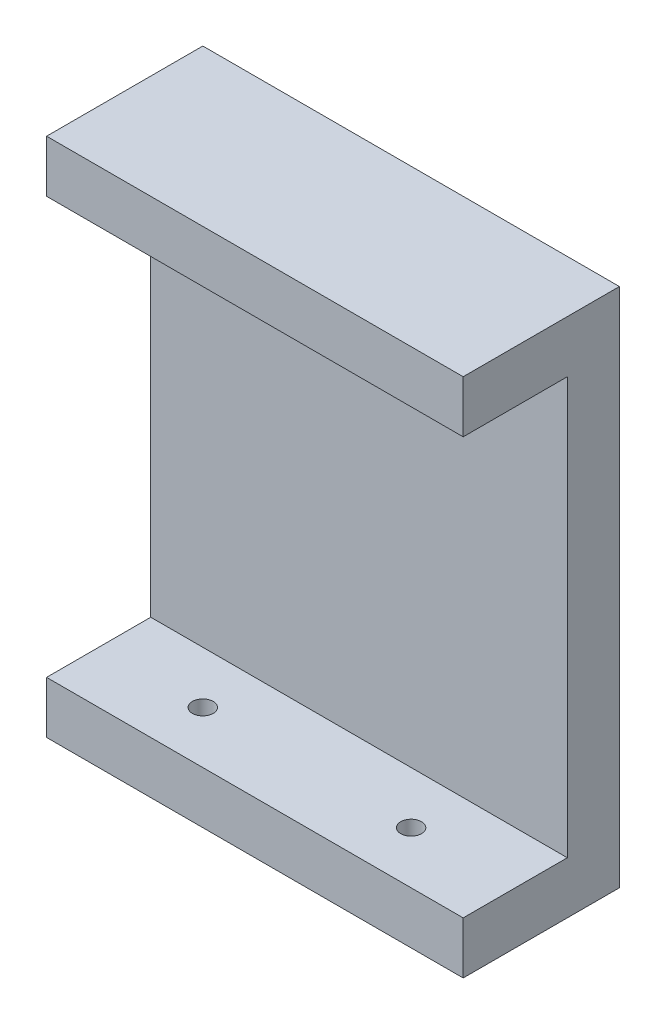
ISO-10303-21;
HEADER;
FILE_DESCRIPTION(('STEP AP214'),'2;1');
FILE_NAME('part.step','',(''),(''),'','','');
FILE_SCHEMA(('AUTOMOTIVE_DESIGN { 1 0 10303 214 1 1 1 1 }'));
ENDSEC;
DATA;
#1=APPLICATION_CONTEXT('core data for automotive mechanical design processes');
#2=APPLICATION_PROTOCOL_DEFINITION('international standard','automotive_design',2000,#1);
#3=PRODUCT_CONTEXT('',#1,'mechanical');
#4=PRODUCT('Part','Part','',(#3));
#5=PRODUCT_RELATED_PRODUCT_CATEGORY('part','',(#4));
#6=PRODUCT_DEFINITION_FORMATION('','',#4);
#7=PRODUCT_DEFINITION_CONTEXT('part definition',#1,'design');
#8=PRODUCT_DEFINITION('design','',#6,#7);
#9=PRODUCT_DEFINITION_SHAPE('','',#8);
#10=(LENGTH_UNIT() NAMED_UNIT(*) SI_UNIT(.MILLI.,.METRE.));
#11=(NAMED_UNIT(*) PLANE_ANGLE_UNIT() SI_UNIT($,.RADIAN.));
#12=(NAMED_UNIT(*) SI_UNIT($,.STERADIAN.) SOLID_ANGLE_UNIT());
#13=UNCERTAINTY_MEASURE_WITH_UNIT(LENGTH_MEASURE(1.E-05),#10,'distance_accuracy_value','');
#14=(GEOMETRIC_REPRESENTATION_CONTEXT(3) GLOBAL_UNCERTAINTY_ASSIGNED_CONTEXT((#13)) GLOBAL_UNIT_ASSIGNED_CONTEXT((#10,
#11,#12)) REPRESENTATION_CONTEXT('',''));
#15=CARTESIAN_POINT('',(0.,0.,0.));
#16=DIRECTION('',(0.,0.,1.));
#17=DIRECTION('',(1.,0.,0.));
#18=AXIS2_PLACEMENT_3D('',#15,#16,#17);
#19=CARTESIAN_POINT('',(0.,0.,10.));
#20=DIRECTION('',(0.,0.,1.));
#21=DIRECTION('',(1.,0.,0.));
#22=AXIS2_PLACEMENT_3D('',#19,#20,#21);
#23=PLANE('',#22);
#24=DIRECTION('',(0.,1.,0.));
#25=VECTOR('',#24,1.);
#26=CARTESIAN_POINT('',(40.,50.,10.));
#27=LINE('',#26,#25);
#28=CARTESIAN_POINT('',(40.,-40.,10.));
#29=VERTEX_POINT('',#28);
#30=CARTESIAN_POINT('',(40.,40.,10.));
#31=VERTEX_POINT('',#30);
#32=EDGE_CURVE('E64',#29,#31,#27,.T.);
#33=ORIENTED_EDGE('',*,*,#32,.T.);
#34=DIRECTION('',(1.,0.,0.));
#35=VECTOR('',#34,1.);
#36=CARTESIAN_POINT('',(-40.,40.,10.));
#37=LINE('',#36,#35);
#38=CARTESIAN_POINT('',(-40.,40.,10.));
#39=VERTEX_POINT('',#38);
#40=EDGE_CURVE('E59',#39,#31,#37,.T.);
#41=ORIENTED_EDGE('',*,*,#40,.F.);
#42=DIRECTION('',(0.,-1.,0.));
#43=VECTOR('',#42,1.);
#44=CARTESIAN_POINT('',(-40.,50.,10.));
#45=LINE('',#44,#43);
#46=CARTESIAN_POINT('',(-40.,-40.,10.));
#47=VERTEX_POINT('',#46);
#48=EDGE_CURVE('E168',#39,#47,#45,.T.);
#49=ORIENTED_EDGE('',*,*,#48,.T.);
#50=DIRECTION('',(-1.,0.,0.));
#51=VECTOR('',#50,1.);
#52=CARTESIAN_POINT('',(-40.,-40.,10.));
#53=LINE('',#52,#51);
#54=EDGE_CURVE('E131',#29,#47,#53,.T.);
#55=ORIENTED_EDGE('',*,*,#54,.F.);
#56=EDGE_LOOP('',(#33,#41,#49,#55));
#57=FACE_BOUND('',#56,.T.);
#58=ADVANCED_FACE('F42',(#57),#23,.T.);
#59=CARTESIAN_POINT('',(40.,50.,10.));
#60=DIRECTION('',(-1.,0.,0.));
#61=DIRECTION('',(0.,-1.,0.));
#62=AXIS2_PLACEMENT_3D('',#59,#60,#61);
#63=PLANE('',#62);
#64=DIRECTION('',(0.,1.,0.));
#65=VECTOR('',#64,1.);
#66=CARTESIAN_POINT('',(40.,50.,0.));
#67=LINE('',#66,#65);
#68=CARTESIAN_POINT('',(40.,-50.,0.));
#69=VERTEX_POINT('',#68);
#70=CARTESIAN_POINT('',(40.,50.,0.));
#71=VERTEX_POINT('',#70);
#72=EDGE_CURVE('E158',#69,#71,#67,.T.);
#73=ORIENTED_EDGE('',*,*,#72,.T.);
#74=DIRECTION('',(0.,0.,-1.));
#75=VECTOR('',#74,1.);
#76=CARTESIAN_POINT('',(40.,50.,10.));
#77=LINE('',#76,#75);
#78=CARTESIAN_POINT('',(40.,50.,30.));
#79=VERTEX_POINT('',#78);
#80=EDGE_CURVE('E13',#79,#71,#77,.T.);
#81=ORIENTED_EDGE('',*,*,#80,.F.);
#82=DIRECTION('',(0.,1.,0.));
#83=VECTOR('',#82,1.);
#84=CARTESIAN_POINT('',(40.,50.,30.));
#85=LINE('',#84,#83);
#86=CARTESIAN_POINT('',(40.,40.,30.));
#87=VERTEX_POINT('',#86);
#88=EDGE_CURVE('E123',#87,#79,#85,.T.);
#89=ORIENTED_EDGE('',*,*,#88,.F.);
#90=DIRECTION('',(0.,0.,-1.));
#91=VECTOR('',#90,1.);
#92=CARTESIAN_POINT('',(40.,40.,30.));
#93=LINE('',#92,#91);
#94=EDGE_CURVE('E124',#87,#31,#93,.T.);
#95=ORIENTED_EDGE('',*,*,#94,.T.);
#96=ORIENTED_EDGE('',*,*,#32,.F.);
#97=DIRECTION('',(0.,0.,-1.));
#98=VECTOR('',#97,1.);
#99=CARTESIAN_POINT('',(40.,-40.,30.));
#100=LINE('',#99,#98);
#101=CARTESIAN_POINT('',(40.,-40.,30.));
#102=VERTEX_POINT('',#101);
#103=EDGE_CURVE('E151',#102,#29,#100,.T.);
#104=ORIENTED_EDGE('',*,*,#103,.F.);
#105=DIRECTION('',(0.,1.,0.));
#106=VECTOR('',#105,1.);
#107=CARTESIAN_POINT('',(40.,-50.,30.));
#108=LINE('',#107,#106);
#109=CARTESIAN_POINT('',(40.,-50.,30.));
#110=VERTEX_POINT('',#109);
#111=EDGE_CURVE('E142',#110,#102,#108,.T.);
#112=ORIENTED_EDGE('',*,*,#111,.F.);
#113=DIRECTION('',(0.,0.,-1.));
#114=VECTOR('',#113,1.);
#115=CARTESIAN_POINT('',(40.,-50.,10.));
#116=LINE('',#115,#114);
#117=EDGE_CURVE('E171',#110,#69,#116,.T.);
#118=ORIENTED_EDGE('',*,*,#117,.T.);
#119=EDGE_LOOP('',(#73,#81,#89,#95,#96,#104,#112,#118));
#120=FACE_BOUND('',#119,.T.);
#121=ADVANCED_FACE('F44',(#120),#63,.F.);
#122=CARTESIAN_POINT('',(-40.,50.,10.));
#123=DIRECTION('',(0.,-1.,0.));
#124=DIRECTION('',(0.,0.,-1.));
#125=AXIS2_PLACEMENT_3D('',#122,#123,#124);
#126=PLANE('',#125);
#127=DIRECTION('',(-1.,0.,0.));
#128=VECTOR('',#127,1.);
#129=CARTESIAN_POINT('',(-40.,50.,0.));
#130=LINE('',#129,#128);
#131=CARTESIAN_POINT('',(-40.,50.,0.));
#132=VERTEX_POINT('',#131);
#133=EDGE_CURVE('E110',#71,#132,#130,.T.);
#134=ORIENTED_EDGE('',*,*,#133,.T.);
#135=DIRECTION('',(0.,0.,-1.));
#136=VECTOR('',#135,1.);
#137=CARTESIAN_POINT('',(-40.,50.,10.));
#138=LINE('',#137,#136);
#139=CARTESIAN_POINT('',(-40.,50.,30.));
#140=VERTEX_POINT('',#139);
#141=EDGE_CURVE('E51',#140,#132,#138,.T.);
#142=ORIENTED_EDGE('',*,*,#141,.F.);
#143=DIRECTION('',(-1.,0.,0.));
#144=VECTOR('',#143,1.);
#145=CARTESIAN_POINT('',(-40.,50.,30.));
#146=LINE('',#145,#144);
#147=EDGE_CURVE('E109',#79,#140,#146,.T.);
#148=ORIENTED_EDGE('',*,*,#147,.F.);
#149=ORIENTED_EDGE('',*,*,#80,.T.);
#150=EDGE_LOOP('',(#134,#142,#148,#149));
#151=FACE_BOUND('',#150,.T.);
#152=ADVANCED_FACE('F108',(#151),#126,.F.);
#153=CARTESIAN_POINT('',(-40.,50.,10.));
#154=DIRECTION('',(1.,0.,0.));
#155=DIRECTION('',(0.,1.,0.));
#156=AXIS2_PLACEMENT_3D('',#153,#154,#155);
#157=PLANE('',#156);
#158=DIRECTION('',(0.,-1.,0.));
#159=VECTOR('',#158,1.);
#160=CARTESIAN_POINT('',(-40.,50.,0.));
#161=LINE('',#160,#159);
#162=CARTESIAN_POINT('',(-40.,-50.,0.));
#163=VERTEX_POINT('',#162);
#164=EDGE_CURVE('E175',#132,#163,#161,.T.);
#165=ORIENTED_EDGE('',*,*,#164,.T.);
#166=DIRECTION('',(0.,0.,-1.));
#167=VECTOR('',#166,1.);
#168=CARTESIAN_POINT('',(-40.,-50.,10.));
#169=LINE('',#168,#167);
#170=CARTESIAN_POINT('',(-40.,-50.,30.));
#171=VERTEX_POINT('',#170);
#172=EDGE_CURVE('E114',#171,#163,#169,.T.);
#173=ORIENTED_EDGE('',*,*,#172,.F.);
#174=DIRECTION('',(0.,-1.,0.));
#175=VECTOR('',#174,1.);
#176=CARTESIAN_POINT('',(-40.,-50.,30.));
#177=LINE('',#176,#175);
#178=CARTESIAN_POINT('',(-40.,-40.,30.));
#179=VERTEX_POINT('',#178);
#180=EDGE_CURVE('E136',#179,#171,#177,.T.);
#181=ORIENTED_EDGE('',*,*,#180,.F.);
#182=DIRECTION('',(0.,0.,-1.));
#183=VECTOR('',#182,1.);
#184=CARTESIAN_POINT('',(-40.,-40.,30.));
#185=LINE('',#184,#183);
#186=EDGE_CURVE('E146',#179,#47,#185,.T.);
#187=ORIENTED_EDGE('',*,*,#186,.T.);
#188=ORIENTED_EDGE('',*,*,#48,.F.);
#189=DIRECTION('',(0.,0.,-1.));
#190=VECTOR('',#189,1.);
#191=CARTESIAN_POINT('',(-40.,40.,30.));
#192=LINE('',#191,#190);
#193=CARTESIAN_POINT('',(-40.,40.,30.));
#194=VERTEX_POINT('',#193);
#195=EDGE_CURVE('E128',#194,#39,#192,.T.);
#196=ORIENTED_EDGE('',*,*,#195,.F.);
#197=DIRECTION('',(0.,-1.,0.));
#198=VECTOR('',#197,1.);
#199=CARTESIAN_POINT('',(-40.,50.,30.));
#200=LINE('',#199,#198);
#201=EDGE_CURVE('E120',#140,#194,#200,.T.);
#202=ORIENTED_EDGE('',*,*,#201,.F.);
#203=ORIENTED_EDGE('',*,*,#141,.T.);
#204=EDGE_LOOP('',(#165,#173,#181,#187,#188,#196,#202,#203));
#205=FACE_BOUND('',#204,.T.);
#206=ADVANCED_FACE('F126',(#205),#157,.F.);
#207=CARTESIAN_POINT('',(-40.,-50.,10.));
#208=DIRECTION('',(0.,1.,0.));
#209=DIRECTION('',(0.,0.,1.));
#210=AXIS2_PLACEMENT_3D('',#207,#208,#209);
#211=PLANE('',#210);
#212=DIRECTION('',(1.,0.,0.));
#213=VECTOR('',#212,1.);
#214=CARTESIAN_POINT('',(-40.,-50.,0.));
#215=LINE('',#214,#213);
#216=EDGE_CURVE('E169',#163,#69,#215,.T.);
#217=ORIENTED_EDGE('',*,*,#216,.T.);
#218=ORIENTED_EDGE('',*,*,#117,.F.);
#219=DIRECTION('',(1.,0.,0.));
#220=VECTOR('',#219,1.);
#221=CARTESIAN_POINT('',(-40.,-50.,30.));
#222=LINE('',#221,#220);
#223=EDGE_CURVE('E139',#171,#110,#222,.T.);
#224=ORIENTED_EDGE('',*,*,#223,.F.);
#225=ORIENTED_EDGE('',*,*,#172,.T.);
#226=EDGE_LOOP('',(#217,#218,#224,#225));
#227=FACE_BOUND('',#226,.T.);
#228=ADVANCED_FACE('F245',(#227),#211,.F.);
#229=CARTESIAN_POINT('',(0.,0.,0.));
#230=DIRECTION('',(0.,0.,1.));
#231=DIRECTION('',(1.,0.,0.));
#232=AXIS2_PLACEMENT_3D('',#229,#230,#231);
#233=PLANE('',#232);
#234=CARTESIAN_POINT('',(30.,-20.,0.));
#235=DIRECTION('',(0.,0.,-1.));
#236=DIRECTION('',(-1.,0.,0.));
#237=AXIS2_PLACEMENT_3D('',#234,#235,#236);
#238=CIRCLE('',#237,4.);
#239=CARTESIAN_POINT('',(26.,-20.,0.));
#240=VERTEX_POINT('',#239);
#241=EDGE_CURVE('E159',#240,#240,#238,.T.);
#242=ORIENTED_EDGE('',*,*,#241,.F.);
#243=EDGE_LOOP('',(#242));
#244=FACE_BOUND('',#243,.T.);
#245=CARTESIAN_POINT('',(-30.,-20.,0.));
#246=DIRECTION('',(0.,0.,-1.));
#247=DIRECTION('',(1.,0.,0.));
#248=AXIS2_PLACEMENT_3D('',#245,#246,#247);
#249=CIRCLE('',#248,3.99999999999999);
#250=CARTESIAN_POINT('',(-26.,-20.,0.));
#251=VERTEX_POINT('',#250);
#252=EDGE_CURVE('E162',#251,#251,#249,.T.);
#253=ORIENTED_EDGE('',*,*,#252,.F.);
#254=EDGE_LOOP('',(#253));
#255=FACE_BOUND('',#254,.T.);
#256=ORIENTED_EDGE('',*,*,#72,.F.);
#257=ORIENTED_EDGE('',*,*,#216,.F.);
#258=ORIENTED_EDGE('',*,*,#164,.F.);
#259=ORIENTED_EDGE('',*,*,#133,.F.);
#260=EDGE_LOOP('',(#256,#257,#258,#259));
#261=FACE_BOUND('',#260,.T.);
#262=ADVANCED_FACE('F241',(#244,#255,#261),#233,.F.);
#263=CARTESIAN_POINT('',(-30.,-20.,7.));
#264=DIRECTION('',(0.,0.,-1.));
#265=DIRECTION('',(-1.,0.,0.));
#266=AXIS2_PLACEMENT_3D('',#263,#264,#265);
#267=CYLINDRICAL_SURFACE('',#266,3.99999999999999);
#268=CARTESIAN_POINT('',(-30.,-20.,7.));
#269=DIRECTION('',(0.,0.,-1.));
#270=DIRECTION('',(1.,0.,0.));
#271=AXIS2_PLACEMENT_3D('',#268,#269,#270);
#272=CIRCLE('',#271,3.99999999999999);
#273=CARTESIAN_POINT('',(-26.,-20.,7.));
#274=VERTEX_POINT('',#273);
#275=EDGE_CURVE('E154',#274,#274,#272,.T.);
#276=ORIENTED_EDGE('',*,*,#275,.F.);
#277=EDGE_LOOP('',(#276));
#278=FACE_BOUND('',#277,.T.);
#279=ORIENTED_EDGE('',*,*,#252,.T.);
#280=EDGE_LOOP('',(#279));
#281=FACE_BOUND('',#280,.T.);
#282=ADVANCED_FACE('F244',(#278,#281),#267,.F.);
#283=CARTESIAN_POINT('',(-30.,-20.,7.));
#284=DIRECTION('',(0.,0.,1.));
#285=DIRECTION('',(1.,0.,0.));
#286=AXIS2_PLACEMENT_3D('',#283,#284,#285);
#287=PLANE('',#286);
#288=ORIENTED_EDGE('',*,*,#275,.T.);
#289=EDGE_LOOP('',(#288));
#290=FACE_BOUND('',#289,.T.);
#291=ADVANCED_FACE('F239',(#290),#287,.F.);
#292=CARTESIAN_POINT('',(30.,-20.,7.));
#293=DIRECTION('',(0.,0.,-1.));
#294=DIRECTION('',(-1.,0.,0.));
#295=AXIS2_PLACEMENT_3D('',#292,#293,#294);
#296=CYLINDRICAL_SURFACE('',#295,4.);
#297=CARTESIAN_POINT('',(30.,-20.,7.));
#298=DIRECTION('',(0.,0.,-1.));
#299=DIRECTION('',(-1.,0.,0.));
#300=AXIS2_PLACEMENT_3D('',#297,#298,#299);
#301=CIRCLE('',#300,4.);
#302=CARTESIAN_POINT('',(26.,-20.,7.));
#303=VERTEX_POINT('',#302);
#304=EDGE_CURVE('E155',#303,#303,#301,.T.);
#305=ORIENTED_EDGE('',*,*,#304,.F.);
#306=EDGE_LOOP('',(#305));
#307=FACE_BOUND('',#306,.T.);
#308=ORIENTED_EDGE('',*,*,#241,.T.);
#309=EDGE_LOOP('',(#308));
#310=FACE_BOUND('',#309,.T.);
#311=ADVANCED_FACE('F396',(#307,#310),#296,.F.);
#312=CARTESIAN_POINT('',(30.,-20.,7.));
#313=DIRECTION('',(0.,0.,-1.));
#314=DIRECTION('',(-1.,0.,0.));
#315=AXIS2_PLACEMENT_3D('',#312,#313,#314);
#316=PLANE('',#315);
#317=ORIENTED_EDGE('',*,*,#304,.T.);
#318=EDGE_LOOP('',(#317));
#319=FACE_BOUND('',#318,.T.);
#320=ADVANCED_FACE('F282',(#319),#316,.T.);
#321=CARTESIAN_POINT('',(-40.,-40.,30.));
#322=DIRECTION('',(0.,-1.,0.));
#323=DIRECTION('',(0.,0.,-1.));
#324=AXIS2_PLACEMENT_3D('',#321,#322,#323);
#325=PLANE('',#324);
#326=CARTESIAN_POINT('',(-20.,-40.,20.));
#327=DIRECTION('',(0.,-1.,0.));
#328=DIRECTION('',(0.,0.,-1.));
#329=AXIS2_PLACEMENT_3D('',#326,#327,#328);
#330=CIRCLE('',#329,2.);
#331=CARTESIAN_POINT('',(-20.,-40.,18.));
#332=VERTEX_POINT('',#331);
#333=EDGE_CURVE('E203',#332,#332,#330,.F.);
#334=ORIENTED_EDGE('',*,*,#333,.F.);
#335=EDGE_LOOP('',(#334));
#336=FACE_BOUND('',#335,.T.);
#337=CARTESIAN_POINT('',(20.,-40.,20.));
#338=DIRECTION('',(0.,-1.,0.));
#339=DIRECTION('',(0.,0.,-1.));
#340=AXIS2_PLACEMENT_3D('',#337,#338,#339);
#341=CIRCLE('',#340,2.);
#342=CARTESIAN_POINT('',(20.,-40.,18.));
#343=VERTEX_POINT('',#342);
#344=EDGE_CURVE('E183',#343,#343,#341,.F.);
#345=ORIENTED_EDGE('',*,*,#344,.F.);
#346=EDGE_LOOP('',(#345));
#347=FACE_BOUND('',#346,.T.);
#348=ORIENTED_EDGE('',*,*,#54,.T.);
#349=ORIENTED_EDGE('',*,*,#186,.F.);
#350=DIRECTION('',(-1.,0.,0.));
#351=VECTOR('',#350,1.);
#352=CARTESIAN_POINT('',(-40.,-40.,30.));
#353=LINE('',#352,#351);
#354=EDGE_CURVE('E144',#102,#179,#353,.T.);
#355=ORIENTED_EDGE('',*,*,#354,.F.);
#356=ORIENTED_EDGE('',*,*,#103,.T.);
#357=EDGE_LOOP('',(#348,#349,#355,#356));
#358=FACE_BOUND('',#357,.T.);
#359=ADVANCED_FACE('F225',(#336,#347,#358),#325,.F.);
#360=CARTESIAN_POINT('',(0.,0.,30.));
#361=DIRECTION('',(0.,0.,-1.));
#362=DIRECTION('',(-1.,0.,0.));
#363=AXIS2_PLACEMENT_3D('',#360,#361,#362);
#364=PLANE('',#363);
#365=ORIENTED_EDGE('',*,*,#180,.T.);
#366=ORIENTED_EDGE('',*,*,#223,.T.);
#367=ORIENTED_EDGE('',*,*,#111,.T.);
#368=ORIENTED_EDGE('',*,*,#354,.T.);
#369=EDGE_LOOP('',(#365,#366,#367,#368));
#370=FACE_BOUND('',#369,.T.);
#371=ADVANCED_FACE('F214',(#370),#364,.F.);
#372=CARTESIAN_POINT('',(-40.,40.,30.));
#373=DIRECTION('',(0.,1.,0.));
#374=DIRECTION('',(0.,0.,1.));
#375=AXIS2_PLACEMENT_3D('',#372,#373,#374);
#376=PLANE('',#375);
#377=CARTESIAN_POINT('',(-20.,40.,20.));
#378=DIRECTION('',(0.,1.,0.));
#379=DIRECTION('',(0.,0.,1.));
#380=AXIS2_PLACEMENT_3D('',#377,#378,#379);
#381=CIRCLE('',#380,2.);
#382=CARTESIAN_POINT('',(-20.,40.,22.));
#383=VERTEX_POINT('',#382);
#384=EDGE_CURVE('E46',#383,#383,#381,.F.);
#385=ORIENTED_EDGE('',*,*,#384,.F.);
#386=EDGE_LOOP('',(#385));
#387=FACE_BOUND('',#386,.T.);
#388=CARTESIAN_POINT('',(20.,40.,20.));
#389=DIRECTION('',(0.,1.,0.));
#390=DIRECTION('',(0.,0.,1.));
#391=AXIS2_PLACEMENT_3D('',#388,#389,#390);
#392=CIRCLE('',#391,2.);
#393=CARTESIAN_POINT('',(20.,40.,22.));
#394=VERTEX_POINT('',#393);
#395=EDGE_CURVE('E181',#394,#394,#392,.F.);
#396=ORIENTED_EDGE('',*,*,#395,.F.);
#397=EDGE_LOOP('',(#396));
#398=FACE_BOUND('',#397,.T.);
#399=ORIENTED_EDGE('',*,*,#40,.T.);
#400=ORIENTED_EDGE('',*,*,#94,.F.);
#401=DIRECTION('',(1.,0.,0.));
#402=VECTOR('',#401,1.);
#403=CARTESIAN_POINT('',(-40.,40.,30.));
#404=LINE('',#403,#402);
#405=EDGE_CURVE('E129',#194,#87,#404,.T.);
#406=ORIENTED_EDGE('',*,*,#405,.F.);
#407=ORIENTED_EDGE('',*,*,#195,.T.);
#408=EDGE_LOOP('',(#399,#400,#406,#407));
#409=FACE_BOUND('',#408,.T.);
#410=ADVANCED_FACE('F212',(#387,#398,#409),#376,.F.);
#411=CARTESIAN_POINT('',(0.,0.,30.));
#412=DIRECTION('',(0.,0.,1.));
#413=DIRECTION('',(1.,0.,0.));
#414=AXIS2_PLACEMENT_3D('',#411,#412,#413);
#415=PLANE('',#414);
#416=ORIENTED_EDGE('',*,*,#201,.T.);
#417=ORIENTED_EDGE('',*,*,#405,.T.);
#418=ORIENTED_EDGE('',*,*,#88,.T.);
#419=ORIENTED_EDGE('',*,*,#147,.T.);
#420=EDGE_LOOP('',(#416,#417,#418,#419));
#421=FACE_BOUND('',#420,.T.);
#422=ADVANCED_FACE('F119',(#421),#415,.T.);
#423=CARTESIAN_POINT('',(-40.,45.,30.));
#424=DIRECTION('',(0.,1.,0.));
#425=DIRECTION('',(0.,0.,1.));
#426=AXIS2_PLACEMENT_3D('',#423,#424,#425);
#427=PLANE('',#426);
#428=CARTESIAN_POINT('',(20.,45.,20.));
#429=DIRECTION('',(0.,1.,0.));
#430=DIRECTION('',(0.,0.,1.));
#431=AXIS2_PLACEMENT_3D('',#428,#429,#430);
#432=CIRCLE('',#431,2.);
#433=CARTESIAN_POINT('',(20.,45.,22.));
#434=VERTEX_POINT('',#433);
#435=EDGE_CURVE('E198',#434,#434,#432,.T.);
#436=ORIENTED_EDGE('',*,*,#435,.F.);
#437=EDGE_LOOP('',(#436));
#438=FACE_BOUND('',#437,.T.);
#439=ADVANCED_FACE('F222',(#438),#427,.F.);
#440=CARTESIAN_POINT('',(20.,55.6568542494924,20.));
#441=DIRECTION('',(0.,-1.,0.));
#442=DIRECTION('',(0.,0.,-1.));
#443=AXIS2_PLACEMENT_3D('',#440,#441,#442);
#444=CYLINDRICAL_SURFACE('',#443,2.);
#445=ORIENTED_EDGE('',*,*,#435,.T.);
#446=EDGE_LOOP('',(#445));
#447=FACE_BOUND('',#446,.T.);
#448=ORIENTED_EDGE('',*,*,#395,.T.);
#449=EDGE_LOOP('',(#448));
#450=FACE_BOUND('',#449,.T.);
#451=ADVANCED_FACE('F301',(#447,#450),#444,.F.);
#452=CARTESIAN_POINT('',(-40.,45.,30.));
#453=DIRECTION('',(0.,1.,0.));
#454=DIRECTION('',(0.,0.,1.));
#455=AXIS2_PLACEMENT_3D('',#452,#453,#454);
#456=PLANE('',#455);
#457=CARTESIAN_POINT('',(-20.,45.,20.));
#458=DIRECTION('',(0.,1.,0.));
#459=DIRECTION('',(0.,0.,1.));
#460=AXIS2_PLACEMENT_3D('',#457,#458,#459);
#461=CIRCLE('',#460,2.);
#462=CARTESIAN_POINT('',(-20.,45.,22.));
#463=VERTEX_POINT('',#462);
#464=EDGE_CURVE('E184',#463,#463,#461,.T.);
#465=ORIENTED_EDGE('',*,*,#464,.F.);
#466=EDGE_LOOP('',(#465));
#467=FACE_BOUND('',#466,.T.);
#468=ADVANCED_FACE('F310',(#467),#456,.F.);
#469=CARTESIAN_POINT('',(-20.,55.6568542494924,20.));
#470=DIRECTION('',(0.,-1.,0.));
#471=DIRECTION('',(0.,0.,-1.));
#472=AXIS2_PLACEMENT_3D('',#469,#470,#471);
#473=CYLINDRICAL_SURFACE('',#472,2.);
#474=ORIENTED_EDGE('',*,*,#464,.T.);
#475=EDGE_LOOP('',(#474));
#476=FACE_BOUND('',#475,.T.);
#477=ORIENTED_EDGE('',*,*,#384,.T.);
#478=EDGE_LOOP('',(#477));
#479=FACE_BOUND('',#478,.T.);
#480=ADVANCED_FACE('F320',(#476,#479),#473,.F.);
#481=CARTESIAN_POINT('',(20.,-45.,20.));
#482=DIRECTION('',(0.,1.,0.));
#483=DIRECTION('',(0.,0.,-1.));
#484=AXIS2_PLACEMENT_3D('',#481,#482,#483);
#485=CIRCLE('',#484,2.);
#486=CARTESIAN_POINT('',(20.,-45.,18.));
#487=VERTEX_POINT('',#486);
#488=EDGE_CURVE('E195',#487,#487,#485,.T.);
#489=ORIENTED_EDGE('',*,*,#488,.F.);
#490=EDGE_LOOP('',(#489));
#491=FACE_BOUND('',#490,.T.);
#492=ORIENTED_EDGE('',*,*,#344,.T.);
#493=EDGE_LOOP('',(#492));
#494=FACE_BOUND('',#493,.T.);
#495=ADVANCED_FACE('F313',(#491,#494),#444,.F.);
#496=CARTESIAN_POINT('',(20.,-45.,20.));
#497=DIRECTION('',(0.,-1.,0.));
#498=DIRECTION('',(0.,0.,-1.));
#499=AXIS2_PLACEMENT_3D('',#496,#497,#498);
#500=PLANE('',#499);
#501=ORIENTED_EDGE('',*,*,#488,.T.);
#502=EDGE_LOOP('',(#501));
#503=FACE_BOUND('',#502,.T.);
#504=ADVANCED_FACE('F337',(#503),#500,.F.);
#505=CARTESIAN_POINT('',(-20.,-45.,20.));
#506=DIRECTION('',(0.,1.,0.));
#507=DIRECTION('',(0.,0.,1.));
#508=AXIS2_PLACEMENT_3D('',#505,#506,#507);
#509=CIRCLE('',#508,2.);
#510=CARTESIAN_POINT('',(-20.,-45.,22.));
#511=VERTEX_POINT('',#510);
#512=EDGE_CURVE('E190',#511,#511,#509,.T.);
#513=ORIENTED_EDGE('',*,*,#512,.F.);
#514=EDGE_LOOP('',(#513));
#515=FACE_BOUND('',#514,.T.);
#516=ORIENTED_EDGE('',*,*,#333,.T.);
#517=EDGE_LOOP('',(#516));
#518=FACE_BOUND('',#517,.T.);
#519=ADVANCED_FACE('F330',(#515,#518),#473,.F.);
#520=CARTESIAN_POINT('',(-20.,-45.,20.));
#521=DIRECTION('',(0.,1.,0.));
#522=DIRECTION('',(0.,0.,1.));
#523=AXIS2_PLACEMENT_3D('',#520,#521,#522);
#524=PLANE('',#523);
#525=ORIENTED_EDGE('',*,*,#512,.T.);
#526=EDGE_LOOP('',(#525));
#527=FACE_BOUND('',#526,.T.);
#528=ADVANCED_FACE('F352',(#527),#524,.T.);
#529=CLOSED_SHELL('',(#58,#121,#152,#206,#228,#262,#282,#291,#311,#320,#359,#371,#410,#422,#439,
#451,#468,#480,#495,#504,#519,#528));
#530=MANIFOLD_SOLID_BREP('B2',#529);
#531=ADVANCED_BREP_SHAPE_REPRESENTATION('',(#18,#530),#14);
#532=SHAPE_DEFINITION_REPRESENTATION(#9,#531);
ENDSEC;
END-ISO-10303-21;
